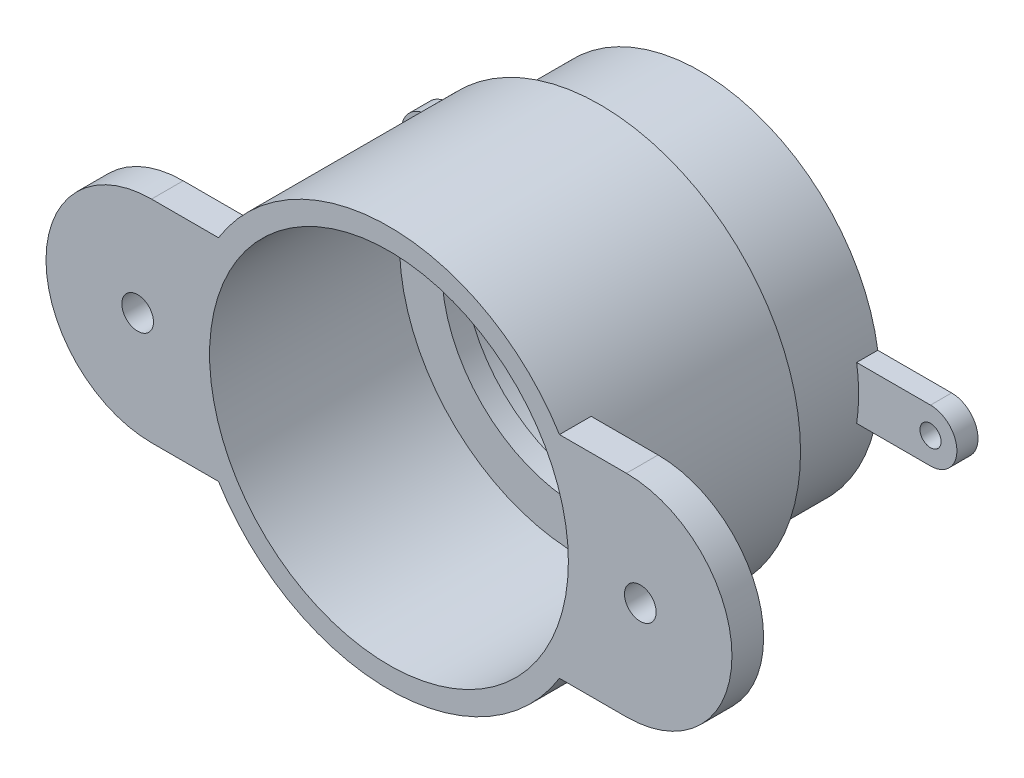
ISO-10303-21;
HEADER;
FILE_DESCRIPTION(('STEP AP214'),'2;1');
FILE_NAME('part.step','',(''),(''),'','','');
FILE_SCHEMA(('AUTOMOTIVE_DESIGN { 1 0 10303 214 1 1 1 1 }'));
ENDSEC;
DATA;
#1=APPLICATION_CONTEXT('core data for automotive mechanical design processes');
#2=APPLICATION_PROTOCOL_DEFINITION('international standard','automotive_design',2000,#1);
#3=PRODUCT_CONTEXT('',#1,'mechanical');
#4=PRODUCT('Part','Part','',(#3));
#5=PRODUCT_RELATED_PRODUCT_CATEGORY('part','',(#4));
#6=PRODUCT_DEFINITION_FORMATION('','',#4);
#7=PRODUCT_DEFINITION_CONTEXT('part definition',#1,'design');
#8=PRODUCT_DEFINITION('design','',#6,#7);
#9=PRODUCT_DEFINITION_SHAPE('','',#8);
#10=(LENGTH_UNIT() NAMED_UNIT(*) SI_UNIT(.MILLI.,.METRE.));
#11=(NAMED_UNIT(*) PLANE_ANGLE_UNIT() SI_UNIT($,.RADIAN.));
#12=(NAMED_UNIT(*) SI_UNIT($,.STERADIAN.) SOLID_ANGLE_UNIT());
#13=UNCERTAINTY_MEASURE_WITH_UNIT(LENGTH_MEASURE(1.E-05),#10,'distance_accuracy_value','');
#14=(GEOMETRIC_REPRESENTATION_CONTEXT(3) GLOBAL_UNCERTAINTY_ASSIGNED_CONTEXT((#13)) GLOBAL_UNIT_ASSIGNED_CONTEXT((#10,
#11,#12)) REPRESENTATION_CONTEXT('',''));
#15=CARTESIAN_POINT('',(0.,0.,0.));
#16=DIRECTION('',(0.,0.,1.));
#17=DIRECTION('',(1.,0.,0.));
#18=AXIS2_PLACEMENT_3D('',#15,#16,#17);
#19=CARTESIAN_POINT('',(0.,0.,20.));
#20=DIRECTION('',(0.,0.,-1.));
#21=DIRECTION('',(-1.,0.,0.));
#22=AXIS2_PLACEMENT_3D('',#19,#20,#21);
#23=CYLINDRICAL_SURFACE('',#22,19.);
#24=CARTESIAN_POINT('',(0.,0.,20.));
#25=DIRECTION('',(0.,0.,1.));
#26=DIRECTION('',(1.,0.,0.));
#27=AXIS2_PLACEMENT_3D('',#24,#25,#26);
#28=CIRCLE('',#27,19.);
#29=CARTESIAN_POINT('',(-16.1554944214035,-10.,20.));
#30=VERTEX_POINT('',#29);
#31=CARTESIAN_POINT('',(16.1554944214035,-10.,20.));
#32=VERTEX_POINT('',#31);
#33=EDGE_CURVE('E285',#30,#32,#28,.T.);
#34=ORIENTED_EDGE('',*,*,#33,.F.);
#35=DIRECTION('',(0.,0.,-1.));
#36=VECTOR('',#35,1.);
#37=CARTESIAN_POINT('',(-16.1554944214035,-10.,20.));
#38=LINE('',#37,#36);
#39=CARTESIAN_POINT('',(-16.1554944214035,-10.,17.));
#40=VERTEX_POINT('',#39);
#41=EDGE_CURVE('E277',#30,#40,#38,.T.);
#42=ORIENTED_EDGE('',*,*,#41,.T.);
#43=CARTESIAN_POINT('',(0.,0.,17.));
#44=DIRECTION('',(0.,0.,1.));
#45=DIRECTION('',(1.,0.,0.));
#46=AXIS2_PLACEMENT_3D('',#43,#44,#45);
#47=CIRCLE('',#46,19.);
#48=CARTESIAN_POINT('',(-16.1554944214035,10.,17.));
#49=VERTEX_POINT('',#48);
#50=EDGE_CURVE('E44',#49,#40,#47,.T.);
#51=ORIENTED_EDGE('',*,*,#50,.F.);
#52=DIRECTION('',(0.,0.,-1.));
#53=VECTOR('',#52,1.);
#54=CARTESIAN_POINT('',(-16.1554944214035,10.,20.));
#55=LINE('',#54,#53);
#56=CARTESIAN_POINT('',(-16.1554944214035,10.,20.));
#57=VERTEX_POINT('',#56);
#58=EDGE_CURVE('E262',#49,#57,#55,.F.);
#59=ORIENTED_EDGE('',*,*,#58,.T.);
#60=CARTESIAN_POINT('',(16.1554944214035,10.,20.));
#61=VERTEX_POINT('',#60);
#62=EDGE_CURVE('E281',#61,#57,#28,.T.);
#63=ORIENTED_EDGE('',*,*,#62,.F.);
#64=DIRECTION('',(0.,0.,-1.));
#65=VECTOR('',#64,1.);
#66=CARTESIAN_POINT('',(16.1554944214035,10.,20.));
#67=LINE('',#66,#65);
#68=CARTESIAN_POINT('',(16.1554944214035,10.,17.));
#69=VERTEX_POINT('',#68);
#70=EDGE_CURVE('E271',#61,#69,#67,.T.);
#71=ORIENTED_EDGE('',*,*,#70,.T.);
#72=CARTESIAN_POINT('',(16.1554944214035,-10.,17.));
#73=VERTEX_POINT('',#72);
#74=EDGE_CURVE('E284',#73,#69,#47,.T.);
#75=ORIENTED_EDGE('',*,*,#74,.F.);
#76=DIRECTION('',(0.,0.,-1.));
#77=VECTOR('',#76,1.);
#78=CARTESIAN_POINT('',(16.1554944214035,-10.,20.));
#79=LINE('',#78,#77);
#80=EDGE_CURVE('E274',#73,#32,#79,.F.);
#81=ORIENTED_EDGE('',*,*,#80,.T.);
#82=EDGE_LOOP('',(#34,#42,#51,#59,#63,#71,#75,#81));
#83=FACE_BOUND('',#82,.T.);
#84=CARTESIAN_POINT('',(0.,0.,0.));
#85=DIRECTION('',(0.,0.,1.));
#86=DIRECTION('',(1.,0.,0.));
#87=AXIS2_PLACEMENT_3D('',#84,#85,#86);
#88=CIRCLE('',#87,19.);
#89=CARTESIAN_POINT('',(19.,0.,0.));
#90=VERTEX_POINT('',#89);
#91=EDGE_CURVE('E280',#90,#90,#88,.T.);
#92=ORIENTED_EDGE('',*,*,#91,.T.);
#93=EDGE_LOOP('',(#92));
#94=FACE_BOUND('',#93,.T.);
#95=ADVANCED_FACE('F37',(#83,#94),#23,.T.);
#96=CARTESIAN_POINT('',(0.,0.,20.));
#97=DIRECTION('',(0.,0.,1.));
#98=DIRECTION('',(1.,0.,0.));
#99=AXIS2_PLACEMENT_3D('',#96,#97,#98);
#100=PLANE('',#99);
#101=CARTESIAN_POINT('',(-23.8151717208002,0.,20.));
#102=DIRECTION('',(0.,0.,1.));
#103=DIRECTION('',(1.,0.,0.));
#104=AXIS2_PLACEMENT_3D('',#101,#102,#103);
#105=CIRCLE('',#104,1.5);
#106=CARTESIAN_POINT('',(-25.3151717208002,0.,20.));
#107=VERTEX_POINT('',#106);
#108=EDGE_CURVE('E707',#107,#107,#105,.T.);
#109=ORIENTED_EDGE('',*,*,#108,.F.);
#110=EDGE_LOOP('',(#109));
#111=FACE_BOUND('',#110,.T.);
#112=CARTESIAN_POINT('',(23.8151717208002,0.,20.));
#113=DIRECTION('',(0.,0.,1.));
#114=DIRECTION('',(1.,0.,0.));
#115=AXIS2_PLACEMENT_3D('',#112,#113,#114);
#116=CIRCLE('',#115,1.5);
#117=CARTESIAN_POINT('',(22.3151717208002,0.,20.));
#118=VERTEX_POINT('',#117);
#119=EDGE_CURVE('E672',#118,#118,#116,.F.);
#120=ORIENTED_EDGE('',*,*,#119,.T.);
#121=EDGE_LOOP('',(#120));
#122=FACE_BOUND('',#121,.T.);
#123=CARTESIAN_POINT('',(0.,0.,20.));
#124=DIRECTION('',(0.,0.,1.));
#125=DIRECTION('',(1.,0.,0.));
#126=AXIS2_PLACEMENT_3D('',#123,#124,#125);
#127=CIRCLE('',#126,17.);
#128=CARTESIAN_POINT('',(17.,0.,20.));
#129=VERTEX_POINT('',#128);
#130=EDGE_CURVE('E226',#129,#129,#127,.T.);
#131=ORIENTED_EDGE('',*,*,#130,.F.);
#132=EDGE_LOOP('',(#131));
#133=FACE_BOUND('',#132,.T.);
#134=ORIENTED_EDGE('',*,*,#62,.T.);
#135=DIRECTION('',(-1.,0.,0.));
#136=VECTOR('',#135,1.);
#137=CARTESIAN_POINT('',(-22.5,10.,20.));
#138=LINE('',#137,#136);
#139=CARTESIAN_POINT('',(-22.5,10.,20.));
#140=VERTEX_POINT('',#139);
#141=EDGE_CURVE('E251',#57,#140,#138,.T.);
#142=ORIENTED_EDGE('',*,*,#141,.T.);
#143=CARTESIAN_POINT('',(-22.5,0.,20.));
#144=DIRECTION('',(0.,0.,1.));
#145=DIRECTION('',(1.,0.,0.));
#146=AXIS2_PLACEMENT_3D('',#143,#144,#145);
#147=CIRCLE('',#146,10.);
#148=CARTESIAN_POINT('',(-22.5,-10.,20.));
#149=VERTEX_POINT('',#148);
#150=EDGE_CURVE('E254',#140,#149,#147,.T.);
#151=ORIENTED_EDGE('',*,*,#150,.T.);
#152=DIRECTION('',(1.,0.,0.));
#153=VECTOR('',#152,1.);
#154=CARTESIAN_POINT('',(-22.5,-10.,20.));
#155=LINE('',#154,#153);
#156=EDGE_CURVE('E237',#149,#30,#155,.T.);
#157=ORIENTED_EDGE('',*,*,#156,.T.);
#158=ORIENTED_EDGE('',*,*,#33,.T.);
#159=CARTESIAN_POINT('',(22.5,-10.,20.));
#160=VERTEX_POINT('',#159);
#161=EDGE_CURVE('E257',#32,#160,#155,.T.);
#162=ORIENTED_EDGE('',*,*,#161,.T.);
#163=CARTESIAN_POINT('',(22.5,0.,20.));
#164=DIRECTION('',(0.,0.,1.));
#165=DIRECTION('',(1.,0.,0.));
#166=AXIS2_PLACEMENT_3D('',#163,#164,#165);
#167=CIRCLE('',#166,10.);
#168=CARTESIAN_POINT('',(22.5,10.,20.));
#169=VERTEX_POINT('',#168);
#170=EDGE_CURVE('E230',#160,#169,#167,.T.);
#171=ORIENTED_EDGE('',*,*,#170,.T.);
#172=EDGE_CURVE('E252',#169,#61,#138,.T.);
#173=ORIENTED_EDGE('',*,*,#172,.T.);
#174=EDGE_LOOP('',(#134,#142,#151,#157,#158,#162,#171,#173));
#175=FACE_BOUND('',#174,.T.);
#176=ADVANCED_FACE('F306',(#111,#122,#133,#175),#100,.T.);
#177=CARTESIAN_POINT('',(0.,0.,0.));
#178=DIRECTION('',(0.,0.,1.));
#179=DIRECTION('',(1.,0.,0.));
#180=AXIS2_PLACEMENT_3D('',#177,#178,#179);
#181=PLANE('',#180);
#182=CARTESIAN_POINT('',(0.,0.,0.));
#183=DIRECTION('',(0.,0.,1.));
#184=DIRECTION('',(1.,0.,0.));
#185=AXIS2_PLACEMENT_3D('',#182,#183,#184);
#186=CIRCLE('',#185,17.);
#187=CARTESIAN_POINT('',(17.,0.,0.));
#188=VERTEX_POINT('',#187);
#189=EDGE_CURVE('E11',#188,#188,#186,.F.);
#190=ORIENTED_EDGE('',*,*,#189,.F.);
#191=EDGE_LOOP('',(#190));
#192=FACE_BOUND('',#191,.T.);
#193=ORIENTED_EDGE('',*,*,#91,.F.);
#194=EDGE_LOOP('',(#193));
#195=FACE_BOUND('',#194,.T.);
#196=ADVANCED_FACE('F341',(#192,#195),#181,.F.);
#197=CARTESIAN_POINT('',(22.5,0.,17.));
#198=DIRECTION('',(0.,0.,1.));
#199=DIRECTION('',(1.,0.,0.));
#200=AXIS2_PLACEMENT_3D('',#197,#198,#199);
#201=CYLINDRICAL_SURFACE('',#200,10.);
#202=ORIENTED_EDGE('',*,*,#170,.F.);
#203=DIRECTION('',(0.,0.,1.));
#204=VECTOR('',#203,1.);
#205=CARTESIAN_POINT('',(22.5,-10.,17.));
#206=LINE('',#205,#204);
#207=CARTESIAN_POINT('',(22.5,-10.,17.));
#208=VERTEX_POINT('',#207);
#209=EDGE_CURVE('E259',#208,#160,#206,.T.);
#210=ORIENTED_EDGE('',*,*,#209,.F.);
#211=CARTESIAN_POINT('',(22.5,0.,17.));
#212=DIRECTION('',(0.,0.,1.));
#213=DIRECTION('',(1.,0.,0.));
#214=AXIS2_PLACEMENT_3D('',#211,#212,#213);
#215=CIRCLE('',#214,10.);
#216=CARTESIAN_POINT('',(22.5,10.,17.));
#217=VERTEX_POINT('',#216);
#218=EDGE_CURVE('E233',#208,#217,#215,.T.);
#219=ORIENTED_EDGE('',*,*,#218,.T.);
#220=DIRECTION('',(0.,0.,1.));
#221=VECTOR('',#220,1.);
#222=CARTESIAN_POINT('',(22.5,10.,17.));
#223=LINE('',#222,#221);
#224=EDGE_CURVE('E248',#217,#169,#223,.T.);
#225=ORIENTED_EDGE('',*,*,#224,.T.);
#226=EDGE_LOOP('',(#202,#210,#219,#225));
#227=FACE_BOUND('',#226,.T.);
#228=ADVANCED_FACE('F323',(#227),#201,.T.);
#229=CARTESIAN_POINT('',(22.5,0.,17.));
#230=DIRECTION('',(0.,0.,1.));
#231=DIRECTION('',(1.,0.,0.));
#232=AXIS2_PLACEMENT_3D('',#229,#230,#231);
#233=PLANE('',#232);
#234=CARTESIAN_POINT('',(23.8151717208002,0.,17.));
#235=DIRECTION('',(0.,0.,-1.));
#236=DIRECTION('',(-1.,0.,0.));
#237=AXIS2_PLACEMENT_3D('',#234,#235,#236);
#238=CIRCLE('',#237,1.5);
#239=CARTESIAN_POINT('',(22.3151717208002,0.,17.));
#240=VERTEX_POINT('',#239);
#241=EDGE_CURVE('E669',#240,#240,#238,.T.);
#242=ORIENTED_EDGE('',*,*,#241,.F.);
#243=EDGE_LOOP('',(#242));
#244=FACE_BOUND('',#243,.T.);
#245=DIRECTION('',(1.,0.,0.));
#246=VECTOR('',#245,1.);
#247=CARTESIAN_POINT('',(-22.5,-10.,17.));
#248=LINE('',#247,#246);
#249=EDGE_CURVE('E244',#73,#208,#248,.T.);
#250=ORIENTED_EDGE('',*,*,#249,.F.);
#251=ORIENTED_EDGE('',*,*,#74,.T.);
#252=DIRECTION('',(-1.,0.,0.));
#253=VECTOR('',#252,1.);
#254=CARTESIAN_POINT('',(-22.5,10.,17.));
#255=LINE('',#254,#253);
#256=EDGE_CURVE('E238',#217,#69,#255,.T.);
#257=ORIENTED_EDGE('',*,*,#256,.F.);
#258=ORIENTED_EDGE('',*,*,#218,.F.);
#259=EDGE_LOOP('',(#250,#251,#257,#258));
#260=FACE_BOUND('',#259,.T.);
#261=ADVANCED_FACE('F320',(#244,#260),#233,.F.);
#262=CARTESIAN_POINT('',(-22.5,10.,17.));
#263=DIRECTION('',(0.,1.,0.));
#264=DIRECTION('',(-1.,0.,0.));
#265=AXIS2_PLACEMENT_3D('',#262,#263,#264);
#266=PLANE('',#265);
#267=ORIENTED_EDGE('',*,*,#70,.F.);
#268=ORIENTED_EDGE('',*,*,#172,.F.);
#269=ORIENTED_EDGE('',*,*,#224,.F.);
#270=ORIENTED_EDGE('',*,*,#256,.T.);
#271=EDGE_LOOP('',(#267,#268,#269,#270));
#272=FACE_BOUND('',#271,.T.);
#273=ADVANCED_FACE('F318',(#272),#266,.T.);
#274=CARTESIAN_POINT('',(-22.5,-10.,17.));
#275=DIRECTION('',(0.,-1.,0.));
#276=DIRECTION('',(1.,0.,0.));
#277=AXIS2_PLACEMENT_3D('',#274,#275,#276);
#278=PLANE('',#277);
#279=ORIENTED_EDGE('',*,*,#80,.F.);
#280=ORIENTED_EDGE('',*,*,#249,.T.);
#281=ORIENTED_EDGE('',*,*,#209,.T.);
#282=ORIENTED_EDGE('',*,*,#161,.F.);
#283=EDGE_LOOP('',(#279,#280,#281,#282));
#284=FACE_BOUND('',#283,.T.);
#285=ADVANCED_FACE('F325',(#284),#278,.T.);
#286=CARTESIAN_POINT('',(-23.8151717208002,0.,17.));
#287=DIRECTION('',(0.,0.,1.));
#288=DIRECTION('',(1.,0.,0.));
#289=AXIS2_PLACEMENT_3D('',#286,#287,#288);
#290=CIRCLE('',#289,1.5);
#291=CARTESIAN_POINT('',(-25.3151717208002,0.,17.));
#292=VERTEX_POINT('',#291);
#293=EDGE_CURVE('E712',#292,#292,#290,.T.);
#294=ORIENTED_EDGE('',*,*,#293,.T.);
#295=EDGE_LOOP('',(#294));
#296=FACE_BOUND('',#295,.T.);
#297=CARTESIAN_POINT('',(-22.5,10.,17.));
#298=VERTEX_POINT('',#297);
#299=EDGE_CURVE('E236',#49,#298,#255,.T.);
#300=ORIENTED_EDGE('',*,*,#299,.F.);
#301=ORIENTED_EDGE('',*,*,#50,.T.);
#302=CARTESIAN_POINT('',(-22.5,-10.,17.));
#303=VERTEX_POINT('',#302);
#304=EDGE_CURVE('E245',#303,#40,#248,.T.);
#305=ORIENTED_EDGE('',*,*,#304,.F.);
#306=CARTESIAN_POINT('',(-22.5,0.,17.));
#307=DIRECTION('',(0.,0.,1.));
#308=DIRECTION('',(1.,0.,0.));
#309=AXIS2_PLACEMENT_3D('',#306,#307,#308);
#310=CIRCLE('',#309,10.);
#311=EDGE_CURVE('E241',#298,#303,#310,.T.);
#312=ORIENTED_EDGE('',*,*,#311,.F.);
#313=EDGE_LOOP('',(#300,#301,#305,#312));
#314=FACE_BOUND('',#313,.T.);
#315=ADVANCED_FACE('F295',(#296,#314),#233,.F.);
#316=ORIENTED_EDGE('',*,*,#41,.F.);
#317=ORIENTED_EDGE('',*,*,#156,.F.);
#318=DIRECTION('',(0.,0.,1.));
#319=VECTOR('',#318,1.);
#320=CARTESIAN_POINT('',(-22.5,-10.,17.));
#321=LINE('',#320,#319);
#322=EDGE_CURVE('E263',#303,#149,#321,.T.);
#323=ORIENTED_EDGE('',*,*,#322,.F.);
#324=ORIENTED_EDGE('',*,*,#304,.T.);
#325=EDGE_LOOP('',(#316,#317,#323,#324));
#326=FACE_BOUND('',#325,.T.);
#327=ADVANCED_FACE('F300',(#326),#278,.T.);
#328=ORIENTED_EDGE('',*,*,#58,.F.);
#329=ORIENTED_EDGE('',*,*,#299,.T.);
#330=DIRECTION('',(0.,0.,1.));
#331=VECTOR('',#330,1.);
#332=CARTESIAN_POINT('',(-22.5,10.,17.));
#333=LINE('',#332,#331);
#334=EDGE_CURVE('E265',#298,#140,#333,.T.);
#335=ORIENTED_EDGE('',*,*,#334,.T.);
#336=ORIENTED_EDGE('',*,*,#141,.F.);
#337=EDGE_LOOP('',(#328,#329,#335,#336));
#338=FACE_BOUND('',#337,.T.);
#339=ADVANCED_FACE('F312',(#338),#266,.T.);
#340=CARTESIAN_POINT('',(-22.5,0.,17.));
#341=DIRECTION('',(0.,0.,1.));
#342=DIRECTION('',(1.,0.,0.));
#343=AXIS2_PLACEMENT_3D('',#340,#341,#342);
#344=CYLINDRICAL_SURFACE('',#343,10.);
#345=ORIENTED_EDGE('',*,*,#150,.F.);
#346=ORIENTED_EDGE('',*,*,#334,.F.);
#347=ORIENTED_EDGE('',*,*,#311,.T.);
#348=ORIENTED_EDGE('',*,*,#322,.T.);
#349=EDGE_LOOP('',(#345,#346,#347,#348));
#350=FACE_BOUND('',#349,.T.);
#351=ADVANCED_FACE('F310',(#350),#344,.T.);
#352=CARTESIAN_POINT('',(0.,0.,2.));
#353=DIRECTION('',(0.,0.,1.));
#354=DIRECTION('',(1.,0.,0.));
#355=AXIS2_PLACEMENT_3D('',#352,#353,#354);
#356=CYLINDRICAL_SURFACE('',#355,17.);
#357=CARTESIAN_POINT('',(0.,0.,2.));
#358=DIRECTION('',(0.,0.,1.));
#359=DIRECTION('',(1.,0.,0.));
#360=AXIS2_PLACEMENT_3D('',#357,#358,#359);
#361=CIRCLE('',#360,17.);
#362=CARTESIAN_POINT('',(17.,0.,2.));
#363=VERTEX_POINT('',#362);
#364=EDGE_CURVE('E227',#363,#363,#361,.T.);
#365=ORIENTED_EDGE('',*,*,#364,.F.);
#366=EDGE_LOOP('',(#365));
#367=FACE_BOUND('',#366,.T.);
#368=ORIENTED_EDGE('',*,*,#130,.T.);
#369=EDGE_LOOP('',(#368));
#370=FACE_BOUND('',#369,.T.);
#371=ADVANCED_FACE('F354',(#367,#370),#356,.F.);
#372=CARTESIAN_POINT('',(0.,0.,2.));
#373=DIRECTION('',(0.,0.,1.));
#374=DIRECTION('',(1.,0.,0.));
#375=AXIS2_PLACEMENT_3D('',#372,#373,#374);
#376=PLANE('',#375);
#377=CARTESIAN_POINT('',(0.,0.,2.));
#378=DIRECTION('',(0.,0.,1.));
#379=DIRECTION('',(1.,0.,0.));
#380=AXIS2_PLACEMENT_3D('',#377,#378,#379);
#381=CIRCLE('',#380,13.);
#382=CARTESIAN_POINT('',(13.,0.,2.));
#383=VERTEX_POINT('',#382);
#384=EDGE_CURVE('E205',#383,#383,#381,.F.);
#385=ORIENTED_EDGE('',*,*,#384,.T.);
#386=EDGE_LOOP('',(#385));
#387=FACE_BOUND('',#386,.T.);
#388=ORIENTED_EDGE('',*,*,#364,.T.);
#389=EDGE_LOOP('',(#388));
#390=FACE_BOUND('',#389,.T.);
#391=ADVANCED_FACE('F359',(#387,#390),#376,.T.);
#392=CARTESIAN_POINT('',(0.,0.,-9.5));
#393=DIRECTION('',(0.,0.,-1.));
#394=DIRECTION('',(-1.,0.,0.));
#395=AXIS2_PLACEMENT_3D('',#392,#393,#394);
#396=PLANE('',#395);
#397=CARTESIAN_POINT('',(-23.8151717208002,0.,-9.5));
#398=DIRECTION('',(0.,0.,1.));
#399=DIRECTION('',(1.,0.,0.));
#400=AXIS2_PLACEMENT_3D('',#397,#398,#399);
#401=CIRCLE('',#400,1.);
#402=CARTESIAN_POINT('',(-22.8151717208002,0.,-9.5));
#403=VERTEX_POINT('',#402);
#404=EDGE_CURVE('E678',#403,#403,#401,.T.);
#405=ORIENTED_EDGE('',*,*,#404,.T.);
#406=EDGE_LOOP('',(#405));
#407=FACE_BOUND('',#406,.T.);
#408=CARTESIAN_POINT('',(23.8151717208002,0.,-9.5));
#409=DIRECTION('',(0.,0.,-1.));
#410=DIRECTION('',(-1.,0.,0.));
#411=AXIS2_PLACEMENT_3D('',#408,#409,#410);
#412=CIRCLE('',#411,1.);
#413=CARTESIAN_POINT('',(22.8151717208002,0.,-9.5));
#414=VERTEX_POINT('',#413);
#415=EDGE_CURVE('E675',#414,#414,#412,.T.);
#416=ORIENTED_EDGE('',*,*,#415,.F.);
#417=EDGE_LOOP('',(#416));
#418=FACE_BOUND('',#417,.T.);
#419=CARTESIAN_POINT('',(0.,0.,-9.5));
#420=DIRECTION('',(0.,0.,-1.));
#421=DIRECTION('',(-1.,0.,0.));
#422=AXIS2_PLACEMENT_3D('',#419,#420,#421);
#423=CIRCLE('',#422,17.);
#424=CARTESIAN_POINT('',(16.8151717208002,-2.5,-9.5));
#425=VERTEX_POINT('',#424);
#426=CARTESIAN_POINT('',(-16.8151717208002,-2.5,-9.5));
#427=VERTEX_POINT('',#426);
#428=EDGE_CURVE('E224',#425,#427,#423,.T.);
#429=ORIENTED_EDGE('',*,*,#428,.T.);
#430=DIRECTION('',(-1.,0.,0.));
#431=VECTOR('',#430,1.);
#432=CARTESIAN_POINT('',(-16.8151717208002,-2.5,-9.5));
#433=LINE('',#432,#431);
#434=CARTESIAN_POINT('',(-23.8151717208002,-2.5,-9.5));
#435=VERTEX_POINT('',#434);
#436=EDGE_CURVE('E165',#427,#435,#433,.T.);
#437=ORIENTED_EDGE('',*,*,#436,.T.);
#438=CARTESIAN_POINT('',(-23.8151717208002,0.,-9.5));
#439=DIRECTION('',(0.,0.,-1.));
#440=DIRECTION('',(1.,0.,0.));
#441=AXIS2_PLACEMENT_3D('',#438,#439,#440);
#442=CIRCLE('',#441,2.5);
#443=CARTESIAN_POINT('',(-23.8151717208002,2.5,-9.5));
#444=VERTEX_POINT('',#443);
#445=EDGE_CURVE('E153',#435,#444,#442,.T.);
#446=ORIENTED_EDGE('',*,*,#445,.T.);
#447=DIRECTION('',(1.,0.,0.));
#448=VECTOR('',#447,1.);
#449=CARTESIAN_POINT('',(-16.8151717208002,2.5,-9.5));
#450=LINE('',#449,#448);
#451=CARTESIAN_POINT('',(-16.8151717208002,2.5,-9.5));
#452=VERTEX_POINT('',#451);
#453=EDGE_CURVE('E51',#444,#452,#450,.T.);
#454=ORIENTED_EDGE('',*,*,#453,.T.);
#455=CARTESIAN_POINT('',(16.8151717208002,2.5,-9.5));
#456=VERTEX_POINT('',#455);
#457=EDGE_CURVE('E221',#452,#456,#423,.T.);
#458=ORIENTED_EDGE('',*,*,#457,.T.);
#459=DIRECTION('',(1.,0.,0.));
#460=VECTOR('',#459,1.);
#461=CARTESIAN_POINT('',(16.8151717208002,2.5,-9.5));
#462=LINE('',#461,#460);
#463=CARTESIAN_POINT('',(23.8151717208002,2.5,-9.5));
#464=VERTEX_POINT('',#463);
#465=EDGE_CURVE('E178',#456,#464,#462,.T.);
#466=ORIENTED_EDGE('',*,*,#465,.T.);
#467=CARTESIAN_POINT('',(23.8151717208002,0.,-9.5));
#468=DIRECTION('',(0.,0.,-1.));
#469=DIRECTION('',(-1.,0.,0.));
#470=AXIS2_PLACEMENT_3D('',#467,#468,#469);
#471=CIRCLE('',#470,2.5);
#472=CARTESIAN_POINT('',(23.8151717208002,-2.5,-9.5));
#473=VERTEX_POINT('',#472);
#474=EDGE_CURVE('E200',#464,#473,#471,.T.);
#475=ORIENTED_EDGE('',*,*,#474,.T.);
#476=DIRECTION('',(-1.,0.,0.));
#477=VECTOR('',#476,1.);
#478=CARTESIAN_POINT('',(16.8151717208002,-2.5,-9.5));
#479=LINE('',#478,#477);
#480=EDGE_CURVE('E58',#473,#425,#479,.T.);
#481=ORIENTED_EDGE('',*,*,#480,.T.);
#482=EDGE_LOOP('',(#429,#437,#446,#454,#458,#466,#475,#481));
#483=FACE_BOUND('',#482,.T.);
#484=CARTESIAN_POINT('',(0.,0.,-9.5));
#485=DIRECTION('',(0.,0.,-1.));
#486=DIRECTION('',(-1.,0.,0.));
#487=AXIS2_PLACEMENT_3D('',#484,#485,#486);
#488=CIRCLE('',#487,15.);
#489=CARTESIAN_POINT('',(-15.,0.,-9.5));
#490=VERTEX_POINT('',#489);
#491=EDGE_CURVE('E218',#490,#490,#488,.T.);
#492=ORIENTED_EDGE('',*,*,#491,.F.);
#493=EDGE_LOOP('',(#492));
#494=FACE_BOUND('',#493,.T.);
#495=ADVANCED_FACE('F163',(#407,#418,#483,#494),#396,.T.);
#496=CARTESIAN_POINT('',(0.,0.,-9.5));
#497=DIRECTION('',(0.,0.,1.));
#498=DIRECTION('',(1.,0.,0.));
#499=AXIS2_PLACEMENT_3D('',#496,#497,#498);
#500=CYLINDRICAL_SURFACE('',#499,17.);
#501=ORIENTED_EDGE('',*,*,#457,.F.);
#502=DIRECTION('',(0.,0.,-1.));
#503=VECTOR('',#502,1.);
#504=CARTESIAN_POINT('',(-16.8151717208002,2.5,-7.5));
#505=LINE('',#504,#503);
#506=CARTESIAN_POINT('',(-16.8151717208002,2.5,-7.5));
#507=VERTEX_POINT('',#506);
#508=EDGE_CURVE('E161',#507,#452,#505,.T.);
#509=ORIENTED_EDGE('',*,*,#508,.F.);
#510=CARTESIAN_POINT('',(0.,0.,-7.5));
#511=DIRECTION('',(0.,0.,1.));
#512=DIRECTION('',(-1.,0.,0.));
#513=AXIS2_PLACEMENT_3D('',#510,#511,#512);
#514=CIRCLE('',#513,17.);
#515=CARTESIAN_POINT('',(-16.8151717208002,-2.5,-7.5));
#516=VERTEX_POINT('',#515);
#517=EDGE_CURVE('E170',#507,#516,#514,.T.);
#518=ORIENTED_EDGE('',*,*,#517,.T.);
#519=DIRECTION('',(0.,0.,-1.));
#520=VECTOR('',#519,1.);
#521=CARTESIAN_POINT('',(-16.8151717208002,-2.5,-7.5));
#522=LINE('',#521,#520);
#523=EDGE_CURVE('E181',#516,#427,#522,.T.);
#524=ORIENTED_EDGE('',*,*,#523,.T.);
#525=ORIENTED_EDGE('',*,*,#428,.F.);
#526=DIRECTION('',(0.,0.,-1.));
#527=VECTOR('',#526,1.);
#528=CARTESIAN_POINT('',(16.8151717208002,-2.5,-7.5));
#529=LINE('',#528,#527);
#530=CARTESIAN_POINT('',(16.8151717208002,-2.5,-7.5));
#531=VERTEX_POINT('',#530);
#532=EDGE_CURVE('E203',#531,#425,#529,.T.);
#533=ORIENTED_EDGE('',*,*,#532,.F.);
#534=CARTESIAN_POINT('',(0.,0.,-7.5));
#535=DIRECTION('',(0.,0.,1.));
#536=DIRECTION('',(-1.,0.,0.));
#537=AXIS2_PLACEMENT_3D('',#534,#535,#536);
#538=CIRCLE('',#537,17.);
#539=CARTESIAN_POINT('',(16.8151717208002,2.5,-7.5));
#540=VERTEX_POINT('',#539);
#541=EDGE_CURVE('E185',#531,#540,#538,.T.);
#542=ORIENTED_EDGE('',*,*,#541,.T.);
#543=DIRECTION('',(0.,0.,-1.));
#544=VECTOR('',#543,1.);
#545=CARTESIAN_POINT('',(16.8151717208002,2.5,-7.5));
#546=LINE('',#545,#544);
#547=EDGE_CURVE('E197',#540,#456,#546,.T.);
#548=ORIENTED_EDGE('',*,*,#547,.T.);
#549=EDGE_LOOP('',(#501,#509,#518,#524,#525,#533,#542,#548));
#550=FACE_BOUND('',#549,.T.);
#551=ORIENTED_EDGE('',*,*,#189,.T.);
#552=EDGE_LOOP('',(#551));
#553=FACE_BOUND('',#552,.T.);
#554=ADVANCED_FACE('F386',(#550,#553),#500,.T.);
#555=CARTESIAN_POINT('',(0.,0.,-9.5));
#556=DIRECTION('',(0.,0.,1.));
#557=DIRECTION('',(1.,0.,0.));
#558=AXIS2_PLACEMENT_3D('',#555,#556,#557);
#559=CYLINDRICAL_SURFACE('',#558,15.);
#560=ORIENTED_EDGE('',*,*,#491,.T.);
#561=EDGE_LOOP('',(#560));
#562=FACE_BOUND('',#561,.T.);
#563=CARTESIAN_POINT('',(0.,0.,0.));
#564=DIRECTION('',(0.,0.,-1.));
#565=DIRECTION('',(-1.,0.,0.));
#566=AXIS2_PLACEMENT_3D('',#563,#564,#565);
#567=CIRCLE('',#566,15.);
#568=CARTESIAN_POINT('',(-15.,0.,0.));
#569=VERTEX_POINT('',#568);
#570=EDGE_CURVE('E215',#569,#569,#567,.T.);
#571=ORIENTED_EDGE('',*,*,#570,.F.);
#572=EDGE_LOOP('',(#571));
#573=FACE_BOUND('',#572,.T.);
#574=ADVANCED_FACE('F527',(#562,#573),#559,.F.);
#575=CARTESIAN_POINT('',(0.,0.,0.));
#576=DIRECTION('',(0.,0.,-1.));
#577=DIRECTION('',(-1.,0.,0.));
#578=AXIS2_PLACEMENT_3D('',#575,#576,#577);
#579=CIRCLE('',#578,13.);
#580=CARTESIAN_POINT('',(-13.,0.,0.));
#581=VERTEX_POINT('',#580);
#582=EDGE_CURVE('E212',#581,#581,#579,.T.);
#583=ORIENTED_EDGE('',*,*,#582,.F.);
#584=EDGE_LOOP('',(#583));
#585=FACE_BOUND('',#584,.T.);
#586=ORIENTED_EDGE('',*,*,#570,.T.);
#587=EDGE_LOOP('',(#586));
#588=FACE_BOUND('',#587,.T.);
#589=ADVANCED_FACE('F348',(#585,#588),#181,.F.);
#590=CARTESIAN_POINT('',(0.,0.,20.001));
#591=DIRECTION('',(0.,0.,-1.));
#592=DIRECTION('',(-1.,0.,0.));
#593=AXIS2_PLACEMENT_3D('',#590,#591,#592);
#594=CYLINDRICAL_SURFACE('',#593,13.);
#595=ORIENTED_EDGE('',*,*,#384,.F.);
#596=EDGE_LOOP('',(#595));
#597=FACE_BOUND('',#596,.T.);
#598=ORIENTED_EDGE('',*,*,#582,.T.);
#599=EDGE_LOOP('',(#598));
#600=FACE_BOUND('',#599,.T.);
#601=ADVANCED_FACE('F511',(#597,#600),#594,.F.);
#602=CARTESIAN_POINT('',(16.8151717208002,-2.5,-7.5));
#603=DIRECTION('',(0.,-1.,0.));
#604=DIRECTION('',(1.,0.,0.));
#605=AXIS2_PLACEMENT_3D('',#602,#603,#604);
#606=PLANE('',#605);
#607=ORIENTED_EDGE('',*,*,#480,.F.);
#608=DIRECTION('',(0.,0.,-1.));
#609=VECTOR('',#608,1.);
#610=CARTESIAN_POINT('',(23.8151717208002,-2.5,-7.5));
#611=LINE('',#610,#609);
#612=CARTESIAN_POINT('',(23.8151717208002,-2.5,-7.5));
#613=VERTEX_POINT('',#612);
#614=EDGE_CURVE('E206',#613,#473,#611,.T.);
#615=ORIENTED_EDGE('',*,*,#614,.F.);
#616=DIRECTION('',(-1.,0.,0.));
#617=VECTOR('',#616,1.);
#618=CARTESIAN_POINT('',(16.8151717208002,-2.5,-7.5));
#619=LINE('',#618,#617);
#620=EDGE_CURVE('E194',#613,#531,#619,.T.);
#621=ORIENTED_EDGE('',*,*,#620,.T.);
#622=ORIENTED_EDGE('',*,*,#532,.T.);
#623=EDGE_LOOP('',(#607,#615,#621,#622));
#624=FACE_BOUND('',#623,.T.);
#625=ADVANCED_FACE('F502',(#624),#606,.T.);
#626=CARTESIAN_POINT('',(23.8151717208002,0.,-7.5));
#627=DIRECTION('',(0.,0.,-1.));
#628=DIRECTION('',(-1.,0.,0.));
#629=AXIS2_PLACEMENT_3D('',#626,#627,#628);
#630=CYLINDRICAL_SURFACE('',#629,2.5);
#631=ORIENTED_EDGE('',*,*,#474,.F.);
#632=DIRECTION('',(0.,0.,-1.));
#633=VECTOR('',#632,1.);
#634=CARTESIAN_POINT('',(23.8151717208002,2.5,-7.5));
#635=LINE('',#634,#633);
#636=CARTESIAN_POINT('',(23.8151717208002,2.5,-7.5));
#637=VERTEX_POINT('',#636);
#638=EDGE_CURVE('E208',#637,#464,#635,.T.);
#639=ORIENTED_EDGE('',*,*,#638,.F.);
#640=CARTESIAN_POINT('',(23.8151717208002,0.,-7.5));
#641=DIRECTION('',(0.,0.,-1.));
#642=DIRECTION('',(-1.,0.,0.));
#643=AXIS2_PLACEMENT_3D('',#640,#641,#642);
#644=CIRCLE('',#643,2.5);
#645=EDGE_CURVE('E191',#637,#613,#644,.T.);
#646=ORIENTED_EDGE('',*,*,#645,.T.);
#647=ORIENTED_EDGE('',*,*,#614,.T.);
#648=EDGE_LOOP('',(#631,#639,#646,#647));
#649=FACE_BOUND('',#648,.T.);
#650=ADVANCED_FACE('F492',(#649),#630,.T.);
#651=CARTESIAN_POINT('',(16.8151717208002,2.5,-7.5));
#652=DIRECTION('',(0.,1.,0.));
#653=DIRECTION('',(-1.,0.,0.));
#654=AXIS2_PLACEMENT_3D('',#651,#652,#653);
#655=PLANE('',#654);
#656=ORIENTED_EDGE('',*,*,#465,.F.);
#657=ORIENTED_EDGE('',*,*,#547,.F.);
#658=DIRECTION('',(1.,0.,0.));
#659=VECTOR('',#658,1.);
#660=CARTESIAN_POINT('',(16.8151717208002,2.5,-7.5));
#661=LINE('',#660,#659);
#662=EDGE_CURVE('E188',#540,#637,#661,.T.);
#663=ORIENTED_EDGE('',*,*,#662,.T.);
#664=ORIENTED_EDGE('',*,*,#638,.T.);
#665=EDGE_LOOP('',(#656,#657,#663,#664));
#666=FACE_BOUND('',#665,.T.);
#667=ADVANCED_FACE('F482',(#666),#655,.T.);
#668=CARTESIAN_POINT('',(0.,0.,-7.5));
#669=DIRECTION('',(0.,0.,-1.));
#670=DIRECTION('',(-1.,0.,0.));
#671=AXIS2_PLACEMENT_3D('',#668,#669,#670);
#672=PLANE('',#671);
#673=CARTESIAN_POINT('',(23.8151717208002,0.,-7.5));
#674=DIRECTION('',(0.,0.,-1.));
#675=DIRECTION('',(-1.,0.,0.));
#676=AXIS2_PLACEMENT_3D('',#673,#674,#675);
#677=CIRCLE('',#676,1.);
#678=CARTESIAN_POINT('',(22.8151717208002,0.,-7.5));
#679=VERTEX_POINT('',#678);
#680=EDGE_CURVE('E671',#679,#679,#677,.F.);
#681=ORIENTED_EDGE('',*,*,#680,.F.);
#682=EDGE_LOOP('',(#681));
#683=FACE_BOUND('',#682,.T.);
#684=ORIENTED_EDGE('',*,*,#541,.F.);
#685=ORIENTED_EDGE('',*,*,#620,.F.);
#686=ORIENTED_EDGE('',*,*,#645,.F.);
#687=ORIENTED_EDGE('',*,*,#662,.F.);
#688=EDGE_LOOP('',(#684,#685,#686,#687));
#689=FACE_BOUND('',#688,.T.);
#690=ADVANCED_FACE('F473',(#683,#689),#672,.F.);
#691=CARTESIAN_POINT('',(-16.8151717208002,2.5,-7.5));
#692=DIRECTION('',(0.,1.,0.));
#693=DIRECTION('',(-1.,0.,0.));
#694=AXIS2_PLACEMENT_3D('',#691,#692,#693);
#695=PLANE('',#694);
#696=ORIENTED_EDGE('',*,*,#453,.F.);
#697=DIRECTION('',(0.,0.,-1.));
#698=VECTOR('',#697,1.);
#699=CARTESIAN_POINT('',(-23.8151717208002,2.5,-7.5));
#700=LINE('',#699,#698);
#701=CARTESIAN_POINT('',(-23.8151717208002,2.5,-7.5));
#702=VERTEX_POINT('',#701);
#703=EDGE_CURVE('E151',#702,#444,#700,.T.);
#704=ORIENTED_EDGE('',*,*,#703,.F.);
#705=DIRECTION('',(1.,0.,0.));
#706=VECTOR('',#705,1.);
#707=CARTESIAN_POINT('',(-16.8151717208002,2.5,-7.5));
#708=LINE('',#707,#706);
#709=EDGE_CURVE('E179',#702,#507,#708,.T.);
#710=ORIENTED_EDGE('',*,*,#709,.T.);
#711=ORIENTED_EDGE('',*,*,#508,.T.);
#712=EDGE_LOOP('',(#696,#704,#710,#711));
#713=FACE_BOUND('',#712,.T.);
#714=ADVANCED_FACE('F167',(#713),#695,.T.);
#715=CARTESIAN_POINT('',(-23.8151717208002,0.,-7.5));
#716=DIRECTION('',(0.,0.,-1.));
#717=DIRECTION('',(-1.,0.,0.));
#718=AXIS2_PLACEMENT_3D('',#715,#716,#717);
#719=CYLINDRICAL_SURFACE('',#718,2.5);
#720=ORIENTED_EDGE('',*,*,#445,.F.);
#721=DIRECTION('',(0.,0.,-1.));
#722=VECTOR('',#721,1.);
#723=CARTESIAN_POINT('',(-23.8151717208002,-2.5,-7.5));
#724=LINE('',#723,#722);
#725=CARTESIAN_POINT('',(-23.8151717208002,-2.5,-7.5));
#726=VERTEX_POINT('',#725);
#727=EDGE_CURVE('E160',#726,#435,#724,.T.);
#728=ORIENTED_EDGE('',*,*,#727,.F.);
#729=CARTESIAN_POINT('',(-23.8151717208002,0.,-7.5));
#730=DIRECTION('',(0.,0.,-1.));
#731=DIRECTION('',(1.,0.,0.));
#732=AXIS2_PLACEMENT_3D('',#729,#730,#731);
#733=CIRCLE('',#732,2.5);
#734=EDGE_CURVE('E156',#726,#702,#733,.T.);
#735=ORIENTED_EDGE('',*,*,#734,.T.);
#736=ORIENTED_EDGE('',*,*,#703,.T.);
#737=EDGE_LOOP('',(#720,#728,#735,#736));
#738=FACE_BOUND('',#737,.T.);
#739=ADVANCED_FACE('F152',(#738),#719,.T.);
#740=CARTESIAN_POINT('',(-16.8151717208002,-2.5,-7.5));
#741=DIRECTION('',(0.,-1.,0.));
#742=DIRECTION('',(1.,0.,0.));
#743=AXIS2_PLACEMENT_3D('',#740,#741,#742);
#744=PLANE('',#743);
#745=ORIENTED_EDGE('',*,*,#436,.F.);
#746=ORIENTED_EDGE('',*,*,#523,.F.);
#747=DIRECTION('',(-1.,0.,0.));
#748=VECTOR('',#747,1.);
#749=CARTESIAN_POINT('',(-16.8151717208002,-2.5,-7.5));
#750=LINE('',#749,#748);
#751=EDGE_CURVE('E173',#516,#726,#750,.T.);
#752=ORIENTED_EDGE('',*,*,#751,.T.);
#753=ORIENTED_EDGE('',*,*,#727,.T.);
#754=EDGE_LOOP('',(#745,#746,#752,#753));
#755=FACE_BOUND('',#754,.T.);
#756=ADVANCED_FACE('F402',(#755),#744,.T.);
#757=CARTESIAN_POINT('',(0.,0.,-7.5));
#758=DIRECTION('',(0.,0.,-1.));
#759=DIRECTION('',(-1.,0.,0.));
#760=AXIS2_PLACEMENT_3D('',#757,#758,#759);
#761=PLANE('',#760);
#762=CARTESIAN_POINT('',(-23.8151717208002,0.,-7.5));
#763=DIRECTION('',(0.,0.,-1.));
#764=DIRECTION('',(-1.,0.,0.));
#765=AXIS2_PLACEMENT_3D('',#762,#763,#764);
#766=CIRCLE('',#765,1.);
#767=CARTESIAN_POINT('',(-24.8151717208002,0.,-7.5));
#768=VERTEX_POINT('',#767);
#769=EDGE_CURVE('E681',#768,#768,#766,.T.);
#770=ORIENTED_EDGE('',*,*,#769,.T.);
#771=EDGE_LOOP('',(#770));
#772=FACE_BOUND('',#771,.T.);
#773=ORIENTED_EDGE('',*,*,#517,.F.);
#774=ORIENTED_EDGE('',*,*,#709,.F.);
#775=ORIENTED_EDGE('',*,*,#734,.F.);
#776=ORIENTED_EDGE('',*,*,#751,.F.);
#777=EDGE_LOOP('',(#773,#774,#775,#776));
#778=FACE_BOUND('',#777,.T.);
#779=ADVANCED_FACE('F396',(#772,#778),#761,.F.);
#780=CARTESIAN_POINT('',(23.8151717208002,0.,20.001));
#781=DIRECTION('',(0.,0.,-1.));
#782=DIRECTION('',(-1.,0.,0.));
#783=AXIS2_PLACEMENT_3D('',#780,#781,#782);
#784=CYLINDRICAL_SURFACE('',#783,1.);
#785=ORIENTED_EDGE('',*,*,#415,.T.);
#786=EDGE_LOOP('',(#785));
#787=FACE_BOUND('',#786,.T.);
#788=ORIENTED_EDGE('',*,*,#680,.T.);
#789=EDGE_LOOP('',(#788));
#790=FACE_BOUND('',#789,.T.);
#791=ADVANCED_FACE('F401',(#787,#790),#784,.F.);
#792=CARTESIAN_POINT('',(23.8151717208002,0.,20.001));
#793=DIRECTION('',(0.,0.,-1.));
#794=DIRECTION('',(-1.,0.,0.));
#795=AXIS2_PLACEMENT_3D('',#792,#793,#794);
#796=CYLINDRICAL_SURFACE('',#795,1.5);
#797=CARTESIAN_POINT('',(22.3151717208002,0.,20.));
#798=CARTESIAN_POINT('',(22.3151717208002,0.,19.96875));
#799=CARTESIAN_POINT('',(22.3151717208002,0.,19.9375));
#800=CARTESIAN_POINT('',(22.3151717208002,0.,19.875));
#801=CARTESIAN_POINT('',(22.3151717208002,0.,19.84375));
#802=CARTESIAN_POINT('',(22.3151717208002,0.,19.78125));
#803=CARTESIAN_POINT('',(22.3151717208002,0.,19.75));
#804=CARTESIAN_POINT('',(22.3151717208002,0.,19.6875));
#805=CARTESIAN_POINT('',(22.3151717208002,0.,19.65625));
#806=CARTESIAN_POINT('',(22.3151717208002,0.,19.59375));
#807=CARTESIAN_POINT('',(22.3151717208002,0.,19.5625));
#808=CARTESIAN_POINT('',(22.3151717208002,0.,19.5));
#809=CARTESIAN_POINT('',(22.3151717208002,0.,19.46875));
#810=CARTESIAN_POINT('',(22.3151717208002,0.,19.40625));
#811=CARTESIAN_POINT('',(22.3151717208002,0.,19.375));
#812=CARTESIAN_POINT('',(22.3151717208002,0.,19.3125));
#813=CARTESIAN_POINT('',(22.3151717208002,0.,19.28125));
#814=CARTESIAN_POINT('',(22.3151717208002,0.,19.21875));
#815=CARTESIAN_POINT('',(22.3151717208002,0.,19.1875));
#816=CARTESIAN_POINT('',(22.3151717208002,0.,19.125));
#817=CARTESIAN_POINT('',(22.3151717208002,0.,19.09375));
#818=CARTESIAN_POINT('',(22.3151717208002,0.,19.03125));
#819=CARTESIAN_POINT('',(22.3151717208002,0.,19.));
#820=CARTESIAN_POINT('',(22.3151717208002,0.,18.9375));
#821=CARTESIAN_POINT('',(22.3151717208002,0.,18.90625));
#822=CARTESIAN_POINT('',(22.3151717208002,0.,18.84375));
#823=CARTESIAN_POINT('',(22.3151717208002,0.,18.8125));
#824=CARTESIAN_POINT('',(22.3151717208002,0.,18.75));
#825=CARTESIAN_POINT('',(22.3151717208002,0.,18.71875));
#826=CARTESIAN_POINT('',(22.3151717208002,0.,18.65625));
#827=CARTESIAN_POINT('',(22.3151717208002,0.,18.625));
#828=CARTESIAN_POINT('',(22.3151717208002,0.,18.5625));
#829=CARTESIAN_POINT('',(22.3151717208002,0.,18.53125));
#830=CARTESIAN_POINT('',(22.3151717208002,0.,18.46875));
#831=CARTESIAN_POINT('',(22.3151717208002,0.,18.4375));
#832=CARTESIAN_POINT('',(22.3151717208002,0.,18.375));
#833=CARTESIAN_POINT('',(22.3151717208002,0.,18.34375));
#834=CARTESIAN_POINT('',(22.3151717208002,0.,18.28125));
#835=CARTESIAN_POINT('',(22.3151717208002,0.,18.25));
#836=CARTESIAN_POINT('',(22.3151717208002,0.,18.1875));
#837=CARTESIAN_POINT('',(22.3151717208002,0.,18.15625));
#838=CARTESIAN_POINT('',(22.3151717208002,0.,18.09375));
#839=CARTESIAN_POINT('',(22.3151717208002,0.,18.0625));
#840=CARTESIAN_POINT('',(22.3151717208002,0.,18.));
#841=CARTESIAN_POINT('',(22.3151717208002,0.,17.96875));
#842=CARTESIAN_POINT('',(22.3151717208002,0.,17.90625));
#843=CARTESIAN_POINT('',(22.3151717208002,0.,17.875));
#844=CARTESIAN_POINT('',(22.3151717208002,0.,17.8125));
#845=CARTESIAN_POINT('',(22.3151717208002,0.,17.78125));
#846=CARTESIAN_POINT('',(22.3151717208002,0.,17.71875));
#847=CARTESIAN_POINT('',(22.3151717208002,0.,17.6875));
#848=CARTESIAN_POINT('',(22.3151717208002,0.,17.625));
#849=CARTESIAN_POINT('',(22.3151717208002,0.,17.59375));
#850=CARTESIAN_POINT('',(22.3151717208002,0.,17.53125));
#851=CARTESIAN_POINT('',(22.3151717208002,0.,17.5));
#852=CARTESIAN_POINT('',(22.3151717208002,0.,17.4375));
#853=CARTESIAN_POINT('',(22.3151717208002,0.,17.40625));
#854=CARTESIAN_POINT('',(22.3151717208002,0.,17.34375));
#855=CARTESIAN_POINT('',(22.3151717208002,0.,17.3125));
#856=CARTESIAN_POINT('',(22.3151717208002,0.,17.25));
#857=CARTESIAN_POINT('',(22.3151717208002,0.,17.21875));
#858=CARTESIAN_POINT('',(22.3151717208002,0.,17.15625));
#859=CARTESIAN_POINT('',(22.3151717208002,0.,17.125));
#860=CARTESIAN_POINT('',(22.3151717208002,0.,17.0625));
#861=CARTESIAN_POINT('',(22.3151717208002,0.,17.03125));
#862=CARTESIAN_POINT('',(22.3151717208002,0.,17.));
#863=B_SPLINE_CURVE_WITH_KNOTS('',3,(#797,#798,#799,#800,#801,#802,#803,#804,#805,#806,#807,
#808,#809,#810,#811,#812,#813,#814,#815,#816,#817,#818,#819,#820,#821,#822,#823,#824,#825,#826,
#827,#828,#829,#830,#831,#832,#833,#834,#835,#836,#837,#838,#839,#840,#841,#842,#843,#844,#845,
#846,#847,#848,#849,#850,#851,#852,#853,#854,#855,#856,#857,#858,#859,#860,#861,#862),
.UNSPECIFIED.,.F.,.F.,(4,2,2,2,2,2,2,2,2,2,2,2,2,2,2,2,2,2,2,2,2,2,2,2,2,2,2,2,2,2,2,2,4),(0.,
0.0937500000000001,0.1875,0.28125,0.375,0.46875,0.5625,0.656250000000001,0.750000000000001,
0.843750000000001,0.937500000000001,1.03125,1.125,1.21875,1.3125,1.40625,1.5,1.59375,1.6875,
1.78125,1.875,1.96875,2.0625,2.15625,2.25,2.34375,2.4375,2.53125,2.625,2.71875,2.8125,2.90625,
3.),.UNSPECIFIED.);
#864=EDGE_CURVE('BSEAM419',#118,#240,#863,.T.);
#865=ORIENTED_EDGE('',*,*,#119,.F.);
#866=ORIENTED_EDGE('',*,*,#241,.T.);
#867=ORIENTED_EDGE('',*,*,#864,.T.);
#868=ORIENTED_EDGE('',*,*,#864,.F.);
#869=EDGE_LOOP('',(#865,#867,#866,#868));
#870=FACE_BOUND('',#869,.T.);
#871=ADVANCED_FACE('F419',(#870),#796,.F.);
#872=CARTESIAN_POINT('',(-23.8151717208002,0.,20.001));
#873=DIRECTION('',(0.,0.,-1.));
#874=DIRECTION('',(-1.,0.,0.));
#875=AXIS2_PLACEMENT_3D('',#872,#873,#874);
#876=CYLINDRICAL_SURFACE('',#875,1.);
#877=ORIENTED_EDGE('',*,*,#404,.F.);
#878=EDGE_LOOP('',(#877));
#879=FACE_BOUND('',#878,.T.);
#880=ORIENTED_EDGE('',*,*,#769,.F.);
#881=EDGE_LOOP('',(#880));
#882=FACE_BOUND('',#881,.T.);
#883=ADVANCED_FACE('F413',(#879,#882),#876,.F.);
#884=CARTESIAN_POINT('',(-23.8151717208002,0.,20.001));
#885=DIRECTION('',(0.,0.,-1.));
#886=DIRECTION('',(-1.,0.,0.));
#887=AXIS2_PLACEMENT_3D('',#884,#885,#886);
#888=CYLINDRICAL_SURFACE('',#887,1.5);
#889=CARTESIAN_POINT('',(-25.3151717208002,0.,20.));
#890=CARTESIAN_POINT('',(-25.3151717208002,0.,19.96875));
#891=CARTESIAN_POINT('',(-25.3151717208002,0.,19.9375));
#892=CARTESIAN_POINT('',(-25.3151717208002,0.,19.875));
#893=CARTESIAN_POINT('',(-25.3151717208002,0.,19.84375));
#894=CARTESIAN_POINT('',(-25.3151717208002,0.,19.78125));
#895=CARTESIAN_POINT('',(-25.3151717208002,0.,19.75));
#896=CARTESIAN_POINT('',(-25.3151717208002,0.,19.6875));
#897=CARTESIAN_POINT('',(-25.3151717208002,0.,19.65625));
#898=CARTESIAN_POINT('',(-25.3151717208002,0.,19.59375));
#899=CARTESIAN_POINT('',(-25.3151717208002,0.,19.5625));
#900=CARTESIAN_POINT('',(-25.3151717208002,0.,19.5));
#901=CARTESIAN_POINT('',(-25.3151717208002,0.,19.46875));
#902=CARTESIAN_POINT('',(-25.3151717208002,0.,19.40625));
#903=CARTESIAN_POINT('',(-25.3151717208002,0.,19.375));
#904=CARTESIAN_POINT('',(-25.3151717208002,0.,19.3125));
#905=CARTESIAN_POINT('',(-25.3151717208002,0.,19.28125));
#906=CARTESIAN_POINT('',(-25.3151717208002,0.,19.21875));
#907=CARTESIAN_POINT('',(-25.3151717208002,0.,19.1875));
#908=CARTESIAN_POINT('',(-25.3151717208002,0.,19.125));
#909=CARTESIAN_POINT('',(-25.3151717208002,0.,19.09375));
#910=CARTESIAN_POINT('',(-25.3151717208002,0.,19.03125));
#911=CARTESIAN_POINT('',(-25.3151717208002,0.,19.));
#912=CARTESIAN_POINT('',(-25.3151717208002,0.,18.9375));
#913=CARTESIAN_POINT('',(-25.3151717208002,0.,18.90625));
#914=CARTESIAN_POINT('',(-25.3151717208002,0.,18.84375));
#915=CARTESIAN_POINT('',(-25.3151717208002,0.,18.8125));
#916=CARTESIAN_POINT('',(-25.3151717208002,0.,18.75));
#917=CARTESIAN_POINT('',(-25.3151717208002,0.,18.71875));
#918=CARTESIAN_POINT('',(-25.3151717208002,0.,18.65625));
#919=CARTESIAN_POINT('',(-25.3151717208002,0.,18.625));
#920=CARTESIAN_POINT('',(-25.3151717208002,0.,18.5625));
#921=CARTESIAN_POINT('',(-25.3151717208002,0.,18.53125));
#922=CARTESIAN_POINT('',(-25.3151717208002,0.,18.46875));
#923=CARTESIAN_POINT('',(-25.3151717208002,0.,18.4375));
#924=CARTESIAN_POINT('',(-25.3151717208002,0.,18.375));
#925=CARTESIAN_POINT('',(-25.3151717208002,0.,18.34375));
#926=CARTESIAN_POINT('',(-25.3151717208002,0.,18.28125));
#927=CARTESIAN_POINT('',(-25.3151717208002,0.,18.25));
#928=CARTESIAN_POINT('',(-25.3151717208002,0.,18.1875));
#929=CARTESIAN_POINT('',(-25.3151717208002,0.,18.15625));
#930=CARTESIAN_POINT('',(-25.3151717208002,0.,18.09375));
#931=CARTESIAN_POINT('',(-25.3151717208002,0.,18.0625));
#932=CARTESIAN_POINT('',(-25.3151717208002,0.,18.));
#933=CARTESIAN_POINT('',(-25.3151717208002,0.,17.96875));
#934=CARTESIAN_POINT('',(-25.3151717208002,0.,17.90625));
#935=CARTESIAN_POINT('',(-25.3151717208002,0.,17.875));
#936=CARTESIAN_POINT('',(-25.3151717208002,0.,17.8125));
#937=CARTESIAN_POINT('',(-25.3151717208002,0.,17.78125));
#938=CARTESIAN_POINT('',(-25.3151717208002,0.,17.71875));
#939=CARTESIAN_POINT('',(-25.3151717208002,0.,17.6875));
#940=CARTESIAN_POINT('',(-25.3151717208002,0.,17.625));
#941=CARTESIAN_POINT('',(-25.3151717208002,0.,17.59375));
#942=CARTESIAN_POINT('',(-25.3151717208002,0.,17.53125));
#943=CARTESIAN_POINT('',(-25.3151717208002,0.,17.5));
#944=CARTESIAN_POINT('',(-25.3151717208002,0.,17.4375));
#945=CARTESIAN_POINT('',(-25.3151717208002,0.,17.40625));
#946=CARTESIAN_POINT('',(-25.3151717208002,0.,17.34375));
#947=CARTESIAN_POINT('',(-25.3151717208002,0.,17.3125));
#948=CARTESIAN_POINT('',(-25.3151717208002,0.,17.25));
#949=CARTESIAN_POINT('',(-25.3151717208002,0.,17.21875));
#950=CARTESIAN_POINT('',(-25.3151717208002,0.,17.15625));
#951=CARTESIAN_POINT('',(-25.3151717208002,0.,17.125));
#952=CARTESIAN_POINT('',(-25.3151717208002,0.,17.0625));
#953=CARTESIAN_POINT('',(-25.3151717208002,0.,17.03125));
#954=CARTESIAN_POINT('',(-25.3151717208002,0.,17.));
#955=B_SPLINE_CURVE_WITH_KNOTS('',3,(#889,#890,#891,#892,#893,#894,#895,#896,#897,#898,#899,
#900,#901,#902,#903,#904,#905,#906,#907,#908,#909,#910,#911,#912,#913,#914,#915,#916,#917,#918,
#919,#920,#921,#922,#923,#924,#925,#926,#927,#928,#929,#930,#931,#932,#933,#934,#935,#936,#937,
#938,#939,#940,#941,#942,#943,#944,#945,#946,#947,#948,#949,#950,#951,#952,#953,#954),
.UNSPECIFIED.,.F.,.F.,(4,2,2,2,2,2,2,2,2,2,2,2,2,2,2,2,2,2,2,2,2,2,2,2,2,2,2,2,2,2,2,2,4),(0.,
0.0937500000000001,0.1875,0.28125,0.375,0.46875,0.5625,0.656250000000001,0.750000000000001,
0.843750000000001,0.937500000000001,1.03125,1.125,1.21875,1.3125,1.40625,1.5,1.59375,1.6875,
1.78125,1.875,1.96875,2.0625,2.15625,2.25,2.34375,2.4375,2.53125,2.625,2.71875,2.8125,2.90625,
3.),.UNSPECIFIED.);
#956=EDGE_CURVE('BSEAM418',#107,#292,#955,.T.);
#957=ORIENTED_EDGE('',*,*,#108,.T.);
#958=ORIENTED_EDGE('',*,*,#293,.F.);
#959=ORIENTED_EDGE('',*,*,#956,.T.);
#960=ORIENTED_EDGE('',*,*,#956,.F.);
#961=EDGE_LOOP('',(#957,#959,#958,#960));
#962=FACE_BOUND('',#961,.T.);
#963=ADVANCED_FACE('F418',(#962),#888,.F.);
#964=CLOSED_SHELL('',(#95,#176,#196,#228,#261,#273,#285,#315,#327,#339,#351,#371,#391,#495,#554,
#574,#589,#601,#625,#650,#667,#690,#714,#739,#756,#779,#791,#871,#883,#963));
#965=MANIFOLD_SOLID_BREP('B2',#964);
#966=ADVANCED_BREP_SHAPE_REPRESENTATION('',(#18,#965),#14);
#967=SHAPE_DEFINITION_REPRESENTATION(#9,#966);
ENDSEC;
END-ISO-10303-21;
